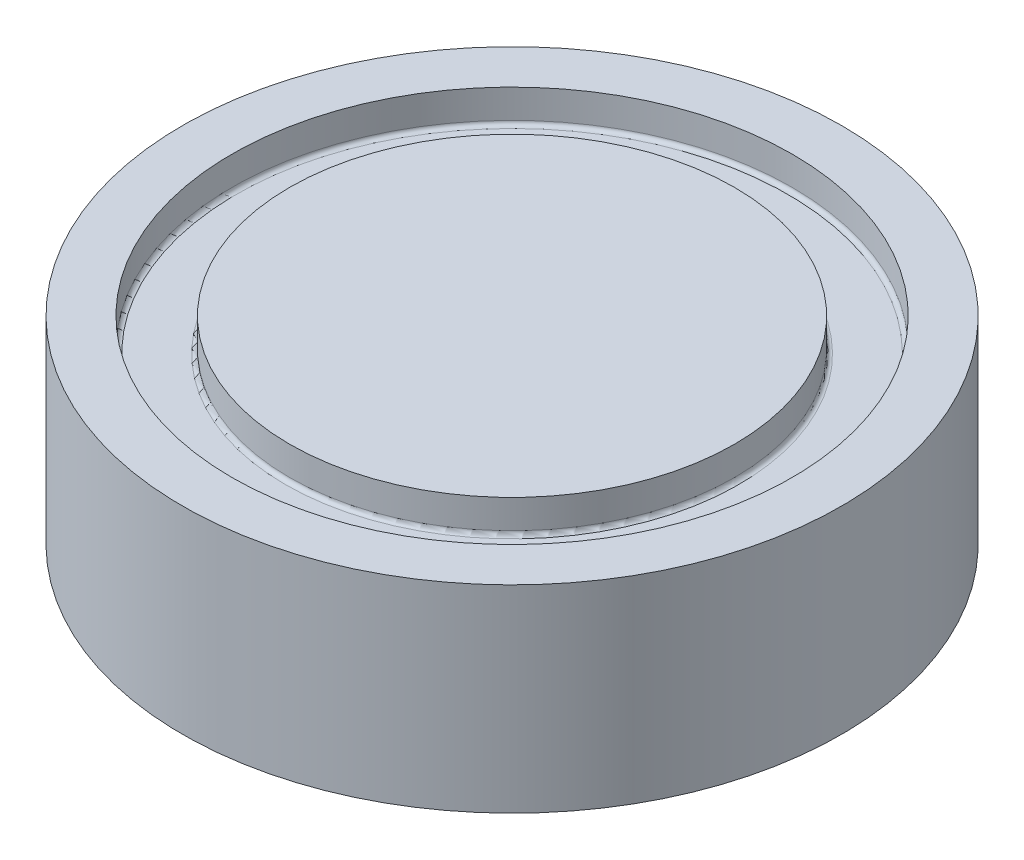
ISO-10303-21;
HEADER;
FILE_DESCRIPTION(('STEP AP214'),'2;1');
FILE_NAME('part.step','',(''),(''),'','','');
FILE_SCHEMA(('AUTOMOTIVE_DESIGN { 1 0 10303 214 1 1 1 1 }'));
ENDSEC;
DATA;
#1=APPLICATION_CONTEXT('core data for automotive mechanical design processes');
#2=APPLICATION_PROTOCOL_DEFINITION('international standard','automotive_design',2000,#1);
#3=PRODUCT_CONTEXT('',#1,'mechanical');
#4=PRODUCT('Part','Part','',(#3));
#5=PRODUCT_RELATED_PRODUCT_CATEGORY('part','',(#4));
#6=PRODUCT_DEFINITION_FORMATION('','',#4);
#7=PRODUCT_DEFINITION_CONTEXT('part definition',#1,'design');
#8=PRODUCT_DEFINITION('design','',#6,#7);
#9=PRODUCT_DEFINITION_SHAPE('','',#8);
#10=(LENGTH_UNIT() NAMED_UNIT(*) SI_UNIT(.MILLI.,.METRE.));
#11=(NAMED_UNIT(*) PLANE_ANGLE_UNIT() SI_UNIT($,.RADIAN.));
#12=(NAMED_UNIT(*) SI_UNIT($,.STERADIAN.) SOLID_ANGLE_UNIT());
#13=UNCERTAINTY_MEASURE_WITH_UNIT(LENGTH_MEASURE(1.E-05),#10,'distance_accuracy_value','');
#14=(GEOMETRIC_REPRESENTATION_CONTEXT(3) GLOBAL_UNCERTAINTY_ASSIGNED_CONTEXT((#13)) GLOBAL_UNIT_ASSIGNED_CONTEXT((#10,
#11,#12)) REPRESENTATION_CONTEXT('',''));
#15=CARTESIAN_POINT('',(0.,0.,0.));
#16=DIRECTION('',(0.,0.,1.));
#17=DIRECTION('',(1.,0.,0.));
#18=AXIS2_PLACEMENT_3D('',#15,#16,#17);
#19=CARTESIAN_POINT('',(0.,30.48,0.));
#20=DIRECTION('',(0.,-1.,0.));
#21=DIRECTION('',(0.,0.,-1.));
#22=AXIS2_PLACEMENT_3D('',#19,#20,#21);
#23=CYLINDRICAL_SURFACE('',#22,50.8);
#24=CARTESIAN_POINT('',(0.,30.48,0.));
#25=DIRECTION('',(0.,1.,0.));
#26=DIRECTION('',(0.,0.,1.));
#27=AXIS2_PLACEMENT_3D('',#24,#25,#26);
#28=CIRCLE('',#27,50.8);
#29=CARTESIAN_POINT('',(0.,30.48,-50.8));
#30=VERTEX_POINT('',#29);
#31=EDGE_CURVE('E73',#30,#30,#28,.T.);
#32=CARTESIAN_POINT('',(0.,0.,0.));
#33=DIRECTION('',(0.,1.,0.));
#34=DIRECTION('',(0.,0.,1.));
#35=AXIS2_PLACEMENT_3D('',#32,#33,#34);
#36=CIRCLE('',#35,50.8);
#37=CARTESIAN_POINT('',(0.,0.,-50.8));
#38=VERTEX_POINT('',#37);
#39=EDGE_CURVE('E69',#38,#38,#36,.T.);
#40=CARTESIAN_POINT('',(0.,30.48,-50.8));
#41=CARTESIAN_POINT('',(0.,30.1625,-50.8));
#42=CARTESIAN_POINT('',(0.,29.845,-50.8));
#43=CARTESIAN_POINT('',(0.,29.21,-50.8));
#44=CARTESIAN_POINT('',(0.,28.8925,-50.8));
#45=CARTESIAN_POINT('',(0.,28.2575,-50.8));
#46=CARTESIAN_POINT('',(0.,27.94,-50.8));
#47=CARTESIAN_POINT('',(0.,27.305,-50.8));
#48=CARTESIAN_POINT('',(0.,26.9875,-50.8));
#49=CARTESIAN_POINT('',(0.,26.3525,-50.8));
#50=CARTESIAN_POINT('',(0.,26.035,-50.8));
#51=CARTESIAN_POINT('',(0.,25.4,-50.8));
#52=CARTESIAN_POINT('',(0.,25.0825,-50.8));
#53=CARTESIAN_POINT('',(0.,24.4475,-50.8));
#54=CARTESIAN_POINT('',(0.,24.13,-50.8));
#55=CARTESIAN_POINT('',(0.,23.495,-50.8));
#56=CARTESIAN_POINT('',(0.,23.1775,-50.8));
#57=CARTESIAN_POINT('',(0.,22.5425,-50.8));
#58=CARTESIAN_POINT('',(0.,22.225,-50.8));
#59=CARTESIAN_POINT('',(0.,21.59,-50.8));
#60=CARTESIAN_POINT('',(0.,21.2725,-50.8));
#61=CARTESIAN_POINT('',(0.,20.6375,-50.8));
#62=CARTESIAN_POINT('',(0.,20.32,-50.8));
#63=CARTESIAN_POINT('',(0.,19.685,-50.8));
#64=CARTESIAN_POINT('',(0.,19.3675,-50.8));
#65=CARTESIAN_POINT('',(0.,18.7325,-50.8));
#66=CARTESIAN_POINT('',(0.,18.415,-50.8));
#67=CARTESIAN_POINT('',(0.,17.78,-50.8));
#68=CARTESIAN_POINT('',(0.,17.4625,-50.8));
#69=CARTESIAN_POINT('',(0.,16.8275,-50.8));
#70=CARTESIAN_POINT('',(0.,16.51,-50.8));
#71=CARTESIAN_POINT('',(0.,15.875,-50.8));
#72=CARTESIAN_POINT('',(0.,15.5575,-50.8));
#73=CARTESIAN_POINT('',(0.,14.9225,-50.8));
#74=CARTESIAN_POINT('',(0.,14.605,-50.8));
#75=CARTESIAN_POINT('',(0.,13.97,-50.8));
#76=CARTESIAN_POINT('',(0.,13.6525,-50.8));
#77=CARTESIAN_POINT('',(0.,13.0175,-50.8));
#78=CARTESIAN_POINT('',(0.,12.7,-50.8));
#79=CARTESIAN_POINT('',(0.,12.065,-50.8));
#80=CARTESIAN_POINT('',(0.,11.7475,-50.8));
#81=CARTESIAN_POINT('',(0.,11.1125,-50.8));
#82=CARTESIAN_POINT('',(0.,10.795,-50.8));
#83=CARTESIAN_POINT('',(0.,10.16,-50.8));
#84=CARTESIAN_POINT('',(0.,9.8425,-50.8));
#85=CARTESIAN_POINT('',(0.,9.2075,-50.8));
#86=CARTESIAN_POINT('',(0.,8.89,-50.8));
#87=CARTESIAN_POINT('',(0.,8.255,-50.8));
#88=CARTESIAN_POINT('',(0.,7.9375,-50.8));
#89=CARTESIAN_POINT('',(0.,7.3025,-50.8));
#90=CARTESIAN_POINT('',(0.,6.985,-50.8));
#91=CARTESIAN_POINT('',(0.,6.35,-50.8));
#92=CARTESIAN_POINT('',(0.,6.0325,-50.8));
#93=CARTESIAN_POINT('',(0.,5.3975,-50.8));
#94=CARTESIAN_POINT('',(0.,5.08,-50.8));
#95=CARTESIAN_POINT('',(0.,4.445,-50.8));
#96=CARTESIAN_POINT('',(0.,4.1275,-50.8));
#97=CARTESIAN_POINT('',(0.,3.4925,-50.8));
#98=CARTESIAN_POINT('',(0.,3.175,-50.8));
#99=CARTESIAN_POINT('',(0.,2.54,-50.8));
#100=CARTESIAN_POINT('',(0.,2.2225,-50.8));
#101=CARTESIAN_POINT('',(0.,1.5875,-50.8));
#102=CARTESIAN_POINT('',(0.,1.27,-50.8));
#103=CARTESIAN_POINT('',(0.,0.634999999999999,-50.8));
#104=CARTESIAN_POINT('',(0.,0.3175,-50.8));
#105=CARTESIAN_POINT('',(0.,0.,-50.8));
#106=B_SPLINE_CURVE_WITH_KNOTS('',3,(#40,#41,#42,#43,#44,#45,#46,#47,#48,#49,#50,#51,#52,#53,
#54,#55,#56,#57,#58,#59,#60,#61,#62,#63,#64,#65,#66,#67,#68,#69,#70,#71,#72,#73,#74,#75,#76,#77,
#78,#79,#80,#81,#82,#83,#84,#85,#86,#87,#88,#89,#90,#91,#92,#93,#94,#95,#96,#97,#98,#99,#100,
#101,#102,#103,#104,#105),.UNSPECIFIED.,.F.,.F.,(4,2,2,2,2,2,2,2,2,2,2,2,2,2,2,2,2,2,2,2,2,2,2,
2,2,2,2,2,2,2,2,2,4),(0.,0.952500000000002,1.905,2.8575,3.81,4.7625,5.715,6.6675,7.62,8.5725,
9.525,10.4775,11.43,12.3825,13.335,14.2875,15.24,16.1925,17.145,18.0975,19.05,20.0025,20.955,
21.9075,22.86,23.8125,24.765,25.7175,26.67,27.6225,28.575,29.5275,30.48),.UNSPECIFIED.);
#107=EDGE_CURVE('BSEAM49',#30,#38,#106,.T.);
#108=ORIENTED_EDGE('',*,*,#31,.F.);
#109=ORIENTED_EDGE('',*,*,#39,.T.);
#110=ORIENTED_EDGE('',*,*,#107,.T.);
#111=ORIENTED_EDGE('',*,*,#107,.F.);
#112=EDGE_LOOP('',(#108,#110,#109,#111));
#113=FACE_BOUND('',#112,.T.);
#114=ADVANCED_FACE('F49',(#113),#23,.T.);
#115=CARTESIAN_POINT('',(0.,30.48,0.));
#116=DIRECTION('',(0.,1.,0.));
#117=DIRECTION('',(0.,0.,1.));
#118=AXIS2_PLACEMENT_3D('',#115,#116,#117);
#119=PLANE('',#118);
#120=CARTESIAN_POINT('',(0.,30.48,0.));
#121=DIRECTION('',(0.,1.,0.));
#122=DIRECTION('',(0.,0.,1.));
#123=AXIS2_PLACEMENT_3D('',#120,#121,#122);
#124=CIRCLE('',#123,43.18);
#125=CARTESIAN_POINT('',(0.,30.48,43.18));
#126=VERTEX_POINT('',#125);
#127=EDGE_CURVE('E76',#126,#126,#124,.T.);
#128=ORIENTED_EDGE('',*,*,#127,.F.);
#129=EDGE_LOOP('',(#128));
#130=FACE_BOUND('',#129,.T.);
#131=ORIENTED_EDGE('',*,*,#31,.T.);
#132=EDGE_LOOP('',(#131));
#133=FACE_BOUND('',#132,.T.);
#134=ADVANCED_FACE('F113',(#130,#133),#119,.T.);
#135=CARTESIAN_POINT('',(0.,0.,0.));
#136=DIRECTION('',(0.,1.,0.));
#137=DIRECTION('',(0.,0.,1.));
#138=AXIS2_PLACEMENT_3D('',#135,#136,#137);
#139=PLANE('',#138);
#140=CARTESIAN_POINT('',(0.,0.,0.));
#141=DIRECTION('',(0.,-1.,0.));
#142=DIRECTION('',(0.,0.,-1.));
#143=AXIS2_PLACEMENT_3D('',#140,#141,#142);
#144=CIRCLE('',#143,11.90625);
#145=CARTESIAN_POINT('',(0.,0.,-11.90625));
#146=VERTEX_POINT('',#145);
#147=EDGE_CURVE('E70',#146,#146,#144,.T.);
#148=ORIENTED_EDGE('',*,*,#147,.F.);
#149=EDGE_LOOP('',(#148));
#150=FACE_BOUND('',#149,.T.);
#151=ORIENTED_EDGE('',*,*,#39,.F.);
#152=EDGE_LOOP('',(#151));
#153=FACE_BOUND('',#152,.T.);
#154=ADVANCED_FACE('F63',(#150,#153),#139,.F.);
#155=CARTESIAN_POINT('',(0.,15.24,0.));
#156=DIRECTION('',(0.,-1.,0.));
#157=DIRECTION('',(0.,0.,-1.));
#158=AXIS2_PLACEMENT_3D('',#155,#156,#157);
#159=CONICAL_SURFACE('',#158,11.90625,1.02974425867665);
#160=CARTESIAN_POINT('',(0.,22.3939967452969,0.));
#161=VERTEX_POINT('',#160);
#162=VERTEX_LOOP('',#161);
#163=FACE_BOUND('',#162,.T.);
#164=CARTESIAN_POINT('',(0.,15.24,0.));
#165=DIRECTION('',(0.,-1.,0.));
#166=DIRECTION('',(0.,0.,-1.));
#167=AXIS2_PLACEMENT_3D('',#164,#165,#166);
#168=CIRCLE('',#167,11.90625);
#169=CARTESIAN_POINT('',(0.,15.24,-11.90625));
#170=VERTEX_POINT('',#169);
#171=EDGE_CURVE('E67',#170,#170,#168,.T.);
#172=ORIENTED_EDGE('',*,*,#171,.T.);
#173=EDGE_LOOP('',(#172));
#174=FACE_BOUND('',#173,.T.);
#175=ADVANCED_FACE('F59',(#163,#174),#159,.F.);
#176=CARTESIAN_POINT('',(0.,0.,0.));
#177=DIRECTION('',(0.,-1.,0.));
#178=DIRECTION('',(0.,0.,-1.));
#179=AXIS2_PLACEMENT_3D('',#176,#177,#178);
#180=CYLINDRICAL_SURFACE('',#179,11.90625);
#181=ORIENTED_EDGE('',*,*,#171,.F.);
#182=EDGE_LOOP('',(#181));
#183=FACE_BOUND('',#182,.T.);
#184=ORIENTED_EDGE('',*,*,#147,.T.);
#185=EDGE_LOOP('',(#184));
#186=FACE_BOUND('',#185,.T.);
#187=ADVANCED_FACE('F62',(#183,#186),#180,.F.);
#188=CARTESIAN_POINT('',(0.,25.4,0.));
#189=DIRECTION('',(0.,1.,0.));
#190=DIRECTION('',(0.,0.,1.));
#191=AXIS2_PLACEMENT_3D('',#188,#189,#190);
#192=CYLINDRICAL_SURFACE('',#191,43.18);
#193=CARTESIAN_POINT('',(0.,26.035,0.));
#194=DIRECTION('',(0.,1.,0.));
#195=DIRECTION('',(0.,0.,1.));
#196=AXIS2_PLACEMENT_3D('',#193,#194,#195);
#197=CIRCLE('',#196,43.18);
#198=CARTESIAN_POINT('',(0.,26.035,43.18));
#199=VERTEX_POINT('',#198);
#200=EDGE_CURVE('E13',#199,#199,#197,.F.);
#201=ORIENTED_EDGE('',*,*,#200,.T.);
#202=EDGE_LOOP('',(#201));
#203=FACE_BOUND('',#202,.T.);
#204=ORIENTED_EDGE('',*,*,#127,.T.);
#205=EDGE_LOOP('',(#204));
#206=FACE_BOUND('',#205,.T.);
#207=ADVANCED_FACE('F111',(#203,#206),#192,.F.);
#208=CARTESIAN_POINT('',(0.,25.4,0.));
#209=DIRECTION('',(0.,1.,0.));
#210=DIRECTION('',(0.,0.,1.));
#211=AXIS2_PLACEMENT_3D('',#208,#209,#210);
#212=PLANE('',#211);
#213=CARTESIAN_POINT('',(0.,25.4,0.));
#214=DIRECTION('',(0.,1.,0.));
#215=DIRECTION('',(0.,0.,1.));
#216=AXIS2_PLACEMENT_3D('',#213,#214,#215);
#217=CIRCLE('',#216,34.925);
#218=CARTESIAN_POINT('',(0.,25.4,34.925));
#219=VERTEX_POINT('',#218);
#220=EDGE_CURVE('E56',#219,#219,#217,.F.);
#221=ORIENTED_EDGE('',*,*,#220,.T.);
#222=EDGE_LOOP('',(#221));
#223=FACE_BOUND('',#222,.T.);
#224=CARTESIAN_POINT('',(0.,25.4,0.));
#225=DIRECTION('',(0.,1.,0.));
#226=DIRECTION('',(0.,0.,1.));
#227=AXIS2_PLACEMENT_3D('',#224,#225,#226);
#228=CIRCLE('',#227,42.545);
#229=CARTESIAN_POINT('',(0.,25.4,42.545));
#230=VERTEX_POINT('',#229);
#231=EDGE_CURVE('E85',#230,#230,#228,.T.);
#232=ORIENTED_EDGE('',*,*,#231,.T.);
#233=EDGE_LOOP('',(#232));
#234=FACE_BOUND('',#233,.T.);
#235=ADVANCED_FACE('F90',(#223,#234),#212,.T.);
#236=CARTESIAN_POINT('',(0.,25.4,0.));
#237=DIRECTION('',(0.,1.,0.));
#238=DIRECTION('',(0.,0.,1.));
#239=AXIS2_PLACEMENT_3D('',#236,#237,#238);
#240=CYLINDRICAL_SURFACE('',#239,34.29);
#241=CARTESIAN_POINT('',(0.,26.035,0.));
#242=DIRECTION('',(0.,1.,0.));
#243=DIRECTION('',(0.,0.,1.));
#244=AXIS2_PLACEMENT_3D('',#241,#242,#243);
#245=CIRCLE('',#244,34.29);
#246=CARTESIAN_POINT('',(0.,26.035,34.29));
#247=VERTEX_POINT('',#246);
#248=EDGE_CURVE('E81',#247,#247,#245,.T.);
#249=ORIENTED_EDGE('',*,*,#248,.T.);
#250=EDGE_LOOP('',(#249));
#251=FACE_BOUND('',#250,.T.);
#252=CARTESIAN_POINT('',(0.,30.48,0.));
#253=DIRECTION('',(0.,1.,0.));
#254=DIRECTION('',(0.,0.,1.));
#255=AXIS2_PLACEMENT_3D('',#252,#253,#254);
#256=CIRCLE('',#255,34.29);
#257=CARTESIAN_POINT('',(0.,30.48,34.29));
#258=VERTEX_POINT('',#257);
#259=EDGE_CURVE('E105',#258,#258,#256,.T.);
#260=ORIENTED_EDGE('',*,*,#259,.F.);
#261=EDGE_LOOP('',(#260));
#262=FACE_BOUND('',#261,.T.);
#263=ADVANCED_FACE('F99',(#251,#262),#240,.T.);
#264=ORIENTED_EDGE('',*,*,#259,.T.);
#265=EDGE_LOOP('',(#264));
#266=FACE_BOUND('',#265,.T.);
#267=ADVANCED_FACE('F96',(#266),#119,.T.);
#268=CARTESIAN_POINT('',(0.,26.035,0.));
#269=DIRECTION('',(0.,1.,0.));
#270=DIRECTION('',(0.,0.,1.));
#271=AXIS2_PLACEMENT_3D('',#268,#269,#270);
#272=TOROIDAL_SURFACE('',#271,34.925,0.635);
#273=ORIENTED_EDGE('',*,*,#220,.F.);
#274=EDGE_LOOP('',(#273));
#275=FACE_BOUND('',#274,.T.);
#276=ORIENTED_EDGE('',*,*,#248,.F.);
#277=EDGE_LOOP('',(#276));
#278=FACE_BOUND('',#277,.T.);
#279=ADVANCED_FACE('F93',(#275,#278),#272,.F.);
#280=CARTESIAN_POINT('',(0.,26.035,0.));
#281=DIRECTION('',(0.,1.,0.));
#282=DIRECTION('',(0.,0.,1.));
#283=AXIS2_PLACEMENT_3D('',#280,#281,#282);
#284=TOROIDAL_SURFACE('',#283,42.545,0.635);
#285=ORIENTED_EDGE('',*,*,#200,.F.);
#286=EDGE_LOOP('',(#285));
#287=FACE_BOUND('',#286,.T.);
#288=ORIENTED_EDGE('',*,*,#231,.F.);
#289=EDGE_LOOP('',(#288));
#290=FACE_BOUND('',#289,.T.);
#291=ADVANCED_FACE('F51',(#287,#290),#284,.F.);
#292=CLOSED_SHELL('',(#114,#134,#154,#175,#187,#207,#235,#263,#267,#279,#291));
#293=MANIFOLD_SOLID_BREP('B2',#292);
#294=ADVANCED_BREP_SHAPE_REPRESENTATION('',(#18,#293),#14);
#295=SHAPE_DEFINITION_REPRESENTATION(#9,#294);
ENDSEC;
END-ISO-10303-21;
